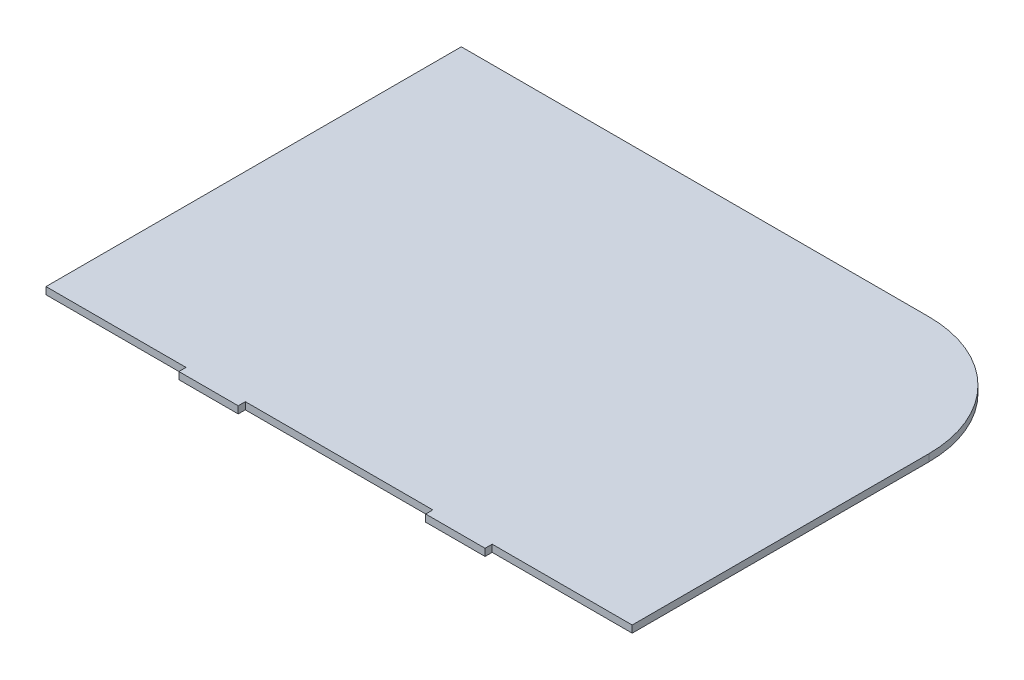
ISO-10303-21;
HEADER;
FILE_DESCRIPTION(('STEP AP214'),'2;1');
FILE_NAME('part.step','',(''),(''),'','','');
FILE_SCHEMA(('AUTOMOTIVE_DESIGN { 1 0 10303 214 1 1 1 1 }'));
ENDSEC;
DATA;
#1=APPLICATION_CONTEXT('core data for automotive mechanical design processes');
#2=APPLICATION_PROTOCOL_DEFINITION('international standard','automotive_design',2000,#1);
#3=PRODUCT_CONTEXT('',#1,'mechanical');
#4=PRODUCT('Part','Part','',(#3));
#5=PRODUCT_RELATED_PRODUCT_CATEGORY('part','',(#4));
#6=PRODUCT_DEFINITION_FORMATION('','',#4);
#7=PRODUCT_DEFINITION_CONTEXT('part definition',#1,'design');
#8=PRODUCT_DEFINITION('design','',#6,#7);
#9=PRODUCT_DEFINITION_SHAPE('','',#8);
#10=(LENGTH_UNIT() NAMED_UNIT(*) SI_UNIT(.MILLI.,.METRE.));
#11=(NAMED_UNIT(*) PLANE_ANGLE_UNIT() SI_UNIT($,.RADIAN.));
#12=(NAMED_UNIT(*) SI_UNIT($,.STERADIAN.) SOLID_ANGLE_UNIT());
#13=UNCERTAINTY_MEASURE_WITH_UNIT(LENGTH_MEASURE(1.E-05),#10,'distance_accuracy_value','');
#14=(GEOMETRIC_REPRESENTATION_CONTEXT(3) GLOBAL_UNCERTAINTY_ASSIGNED_CONTEXT((#13)) GLOBAL_UNIT_ASSIGNED_CONTEXT((#10,
#11,#12)) REPRESENTATION_CONTEXT('',''));
#15=CARTESIAN_POINT('',(0.,0.,0.));
#16=DIRECTION('',(0.,0.,1.));
#17=DIRECTION('',(1.,0.,0.));
#18=AXIS2_PLACEMENT_3D('',#15,#16,#17);
#19=CARTESIAN_POINT('',(222.064062014742,6.,230.864850181117));
#20=DIRECTION('',(-1.,0.,0.));
#21=DIRECTION('',(0.,0.,1.));
#22=AXIS2_PLACEMENT_3D('',#19,#20,#21);
#23=PLANE('',#22);
#24=DIRECTION('',(0.,0.,-1.));
#25=VECTOR('',#24,1.);
#26=CARTESIAN_POINT('',(222.064062014742,0.,230.864850181117));
#27=LINE('',#26,#25);
#28=CARTESIAN_POINT('',(222.064062014742,0.,230.864850181117));
#29=VERTEX_POINT('',#28);
#30=CARTESIAN_POINT('',(222.064062014742,0.,-19.1351498188829));
#31=VERTEX_POINT('',#30);
#32=EDGE_CURVE('E159',#29,#31,#27,.T.);
#33=ORIENTED_EDGE('',*,*,#32,.T.);
#34=DIRECTION('',(0.,-1.,0.));
#35=VECTOR('',#34,1.);
#36=CARTESIAN_POINT('',(222.064062014742,6.,-19.1351498188829));
#37=LINE('',#36,#35);
#38=CARTESIAN_POINT('',(222.064062014742,6.,-19.1351498188829));
#39=VERTEX_POINT('',#38);
#40=EDGE_CURVE('E11',#39,#31,#37,.T.);
#41=ORIENTED_EDGE('',*,*,#40,.F.);
#42=DIRECTION('',(0.,0.,-1.));
#43=VECTOR('',#42,1.);
#44=CARTESIAN_POINT('',(222.064062014742,6.,230.864850181117));
#45=LINE('',#44,#43);
#46=CARTESIAN_POINT('',(222.064062014742,6.,230.864850181117));
#47=VERTEX_POINT('',#46);
#48=EDGE_CURVE('E183',#47,#39,#45,.T.);
#49=ORIENTED_EDGE('',*,*,#48,.F.);
#50=DIRECTION('',(0.,-1.,0.));
#51=VECTOR('',#50,1.);
#52=CARTESIAN_POINT('',(222.064062014742,6.,230.864850181117));
#53=LINE('',#52,#51);
#54=EDGE_CURVE('E155',#47,#29,#53,.T.);
#55=ORIENTED_EDGE('',*,*,#54,.T.);
#56=EDGE_LOOP('',(#33,#41,#49,#55));
#57=FACE_BOUND('',#56,.T.);
#58=ADVANCED_FACE('F33',(#57),#23,.F.);
#59=CARTESIAN_POINT('',(122.064062014742,6.,-19.1351498188829));
#60=DIRECTION('',(0.,-1.,0.));
#61=DIRECTION('',(0.,0.,-1.));
#62=AXIS2_PLACEMENT_3D('',#59,#60,#61);
#63=CYLINDRICAL_SURFACE('',#62,100.);
#64=CARTESIAN_POINT('',(122.064062014742,0.,-19.1351498188829));
#65=DIRECTION('',(0.,1.,0.));
#66=DIRECTION('',(0.,0.,1.));
#67=AXIS2_PLACEMENT_3D('',#64,#65,#66);
#68=CIRCLE('',#67,100.);
#69=CARTESIAN_POINT('',(122.064062014742,0.,-119.135149818883));
#70=VERTEX_POINT('',#69);
#71=EDGE_CURVE('E162',#31,#70,#68,.T.);
#72=ORIENTED_EDGE('',*,*,#71,.T.);
#73=DIRECTION('',(0.,-1.,0.));
#74=VECTOR('',#73,1.);
#75=CARTESIAN_POINT('',(122.064062014742,6.,-119.135149818883));
#76=LINE('',#75,#74);
#77=CARTESIAN_POINT('',(122.064062014742,6.,-119.135149818883));
#78=VERTEX_POINT('',#77);
#79=EDGE_CURVE('E41',#78,#70,#76,.T.);
#80=ORIENTED_EDGE('',*,*,#79,.F.);
#81=CARTESIAN_POINT('',(122.064062014742,6.,-19.1351498188829));
#82=DIRECTION('',(0.,1.,0.));
#83=DIRECTION('',(0.,0.,1.));
#84=AXIS2_PLACEMENT_3D('',#81,#82,#83);
#85=CIRCLE('',#84,100.);
#86=EDGE_CURVE('E107',#39,#78,#85,.T.);
#87=ORIENTED_EDGE('',*,*,#86,.F.);
#88=ORIENTED_EDGE('',*,*,#40,.T.);
#89=EDGE_LOOP('',(#72,#80,#87,#88));
#90=FACE_BOUND('',#89,.T.);
#91=ADVANCED_FACE('F266',(#90),#63,.T.);
#92=CARTESIAN_POINT('',(-271.935937985258,6.,-119.135149818883));
#93=DIRECTION('',(0.,0.,1.));
#94=DIRECTION('',(1.,0.,0.));
#95=AXIS2_PLACEMENT_3D('',#92,#93,#94);
#96=PLANE('',#95);
#97=DIRECTION('',(-1.,0.,0.));
#98=VECTOR('',#97,1.);
#99=CARTESIAN_POINT('',(-271.935937985258,0.,-119.135149818883));
#100=LINE('',#99,#98);
#101=CARTESIAN_POINT('',(-271.935937985258,0.,-119.135149818883));
#102=VERTEX_POINT('',#101);
#103=EDGE_CURVE('E164',#70,#102,#100,.T.);
#104=ORIENTED_EDGE('',*,*,#103,.T.);
#105=DIRECTION('',(0.,-1.,0.));
#106=VECTOR('',#105,1.);
#107=CARTESIAN_POINT('',(-271.935937985258,6.,-119.135149818883));
#108=LINE('',#107,#106);
#109=CARTESIAN_POINT('',(-271.935937985258,6.,-119.135149818883));
#110=VERTEX_POINT('',#109);
#111=EDGE_CURVE('E205',#110,#102,#108,.T.);
#112=ORIENTED_EDGE('',*,*,#111,.F.);
#113=DIRECTION('',(-1.,0.,0.));
#114=VECTOR('',#113,1.);
#115=CARTESIAN_POINT('',(-271.935937985258,6.,-119.135149818883));
#116=LINE('',#115,#114);
#117=EDGE_CURVE('E213',#78,#110,#116,.T.);
#118=ORIENTED_EDGE('',*,*,#117,.F.);
#119=ORIENTED_EDGE('',*,*,#79,.T.);
#120=EDGE_LOOP('',(#104,#112,#118,#119));
#121=FACE_BOUND('',#120,.T.);
#122=ADVANCED_FACE('F211',(#121),#96,.F.);
#123=CARTESIAN_POINT('',(-271.935937985258,6.,-119.135149818883));
#124=DIRECTION('',(1.,0.,0.));
#125=DIRECTION('',(0.,0.,-1.));
#126=AXIS2_PLACEMENT_3D('',#123,#124,#125);
#127=PLANE('',#126);
#128=DIRECTION('',(0.,0.,1.));
#129=VECTOR('',#128,1.);
#130=CARTESIAN_POINT('',(-271.935937985258,0.,-119.135149818883));
#131=LINE('',#130,#129);
#132=CARTESIAN_POINT('',(-271.935937985258,0.,230.864850181117));
#133=VERTEX_POINT('',#132);
#134=EDGE_CURVE('E166',#102,#133,#131,.T.);
#135=ORIENTED_EDGE('',*,*,#134,.T.);
#136=DIRECTION('',(0.,-1.,0.));
#137=VECTOR('',#136,1.);
#138=CARTESIAN_POINT('',(-271.935937985258,6.,230.864850181117));
#139=LINE('',#138,#137);
#140=CARTESIAN_POINT('',(-271.935937985258,6.,230.864850181117));
#141=VERTEX_POINT('',#140);
#142=EDGE_CURVE('E202',#141,#133,#139,.T.);
#143=ORIENTED_EDGE('',*,*,#142,.F.);
#144=DIRECTION('',(0.,0.,1.));
#145=VECTOR('',#144,1.);
#146=CARTESIAN_POINT('',(-271.935937985258,6.,-119.135149818883));
#147=LINE('',#146,#145);
#148=EDGE_CURVE('E231',#110,#141,#147,.T.);
#149=ORIENTED_EDGE('',*,*,#148,.F.);
#150=ORIENTED_EDGE('',*,*,#111,.T.);
#151=EDGE_LOOP('',(#135,#143,#149,#150));
#152=FACE_BOUND('',#151,.T.);
#153=ADVANCED_FACE('F222',(#152),#127,.F.);
#154=CARTESIAN_POINT('',(-271.935937985258,6.,230.864850181117));
#155=DIRECTION('',(0.,0.,-1.));
#156=DIRECTION('',(-1.,0.,0.));
#157=AXIS2_PLACEMENT_3D('',#154,#155,#156);
#158=PLANE('',#157);
#159=DIRECTION('',(1.,0.,0.));
#160=VECTOR('',#159,1.);
#161=CARTESIAN_POINT('',(-271.935937985258,0.,230.864850181117));
#162=LINE('',#161,#160);
#163=CARTESIAN_POINT('',(-153.935937985258,0.,230.864850181117));
#164=VERTEX_POINT('',#163);
#165=EDGE_CURVE('E168',#133,#164,#162,.T.);
#166=ORIENTED_EDGE('',*,*,#165,.T.);
#167=DIRECTION('',(0.,-1.,0.));
#168=VECTOR('',#167,1.);
#169=CARTESIAN_POINT('',(-153.935937985258,6.,230.864850181117));
#170=LINE('',#169,#168);
#171=CARTESIAN_POINT('',(-153.935937985258,6.,230.864850181117));
#172=VERTEX_POINT('',#171);
#173=EDGE_CURVE('E199',#172,#164,#170,.T.);
#174=ORIENTED_EDGE('',*,*,#173,.F.);
#175=DIRECTION('',(1.,0.,0.));
#176=VECTOR('',#175,1.);
#177=CARTESIAN_POINT('',(-271.935937985258,6.,230.864850181117));
#178=LINE('',#177,#176);
#179=EDGE_CURVE('E228',#141,#172,#178,.T.);
#180=ORIENTED_EDGE('',*,*,#179,.F.);
#181=ORIENTED_EDGE('',*,*,#142,.T.);
#182=EDGE_LOOP('',(#166,#174,#180,#181));
#183=FACE_BOUND('',#182,.T.);
#184=ADVANCED_FACE('F226',(#183),#158,.F.);
#185=CARTESIAN_POINT('',(-153.935937985258,6.,230.864850181117));
#186=DIRECTION('',(1.,0.,0.));
#187=DIRECTION('',(0.,0.,-1.));
#188=AXIS2_PLACEMENT_3D('',#185,#186,#187);
#189=PLANE('',#188);
#190=DIRECTION('',(0.,0.,1.));
#191=VECTOR('',#190,1.);
#192=CARTESIAN_POINT('',(-153.935937985258,0.,230.864850181117));
#193=LINE('',#192,#191);
#194=CARTESIAN_POINT('',(-153.935937985258,0.,236.864850181117));
#195=VERTEX_POINT('',#194);
#196=EDGE_CURVE('E170',#164,#195,#193,.T.);
#197=ORIENTED_EDGE('',*,*,#196,.T.);
#198=DIRECTION('',(0.,-1.,0.));
#199=VECTOR('',#198,1.);
#200=CARTESIAN_POINT('',(-153.935937985258,6.,236.864850181117));
#201=LINE('',#200,#199);
#202=CARTESIAN_POINT('',(-153.935937985258,6.,236.864850181117));
#203=VERTEX_POINT('',#202);
#204=EDGE_CURVE('E196',#203,#195,#201,.T.);
#205=ORIENTED_EDGE('',*,*,#204,.F.);
#206=DIRECTION('',(0.,0.,1.));
#207=VECTOR('',#206,1.);
#208=CARTESIAN_POINT('',(-153.935937985258,6.,230.864850181117));
#209=LINE('',#208,#207);
#210=EDGE_CURVE('E230',#172,#203,#209,.T.);
#211=ORIENTED_EDGE('',*,*,#210,.F.);
#212=ORIENTED_EDGE('',*,*,#173,.T.);
#213=EDGE_LOOP('',(#197,#205,#211,#212));
#214=FACE_BOUND('',#213,.T.);
#215=ADVANCED_FACE('F279',(#214),#189,.F.);
#216=CARTESIAN_POINT('',(-153.935937985258,6.,236.864850181117));
#217=DIRECTION('',(0.,0.,-1.));
#218=DIRECTION('',(-1.,0.,0.));
#219=AXIS2_PLACEMENT_3D('',#216,#217,#218);
#220=PLANE('',#219);
#221=DIRECTION('',(1.,0.,0.));
#222=VECTOR('',#221,1.);
#223=CARTESIAN_POINT('',(-153.935937985258,0.,236.864850181117));
#224=LINE('',#223,#222);
#225=CARTESIAN_POINT('',(-103.935937985258,0.,236.864850181117));
#226=VERTEX_POINT('',#225);
#227=EDGE_CURVE('E172',#195,#226,#224,.T.);
#228=ORIENTED_EDGE('',*,*,#227,.T.);
#229=DIRECTION('',(0.,-1.,0.));
#230=VECTOR('',#229,1.);
#231=CARTESIAN_POINT('',(-103.935937985258,6.,236.864850181117));
#232=LINE('',#231,#230);
#233=CARTESIAN_POINT('',(-103.935937985258,6.,236.864850181117));
#234=VERTEX_POINT('',#233);
#235=EDGE_CURVE('E193',#234,#226,#232,.T.);
#236=ORIENTED_EDGE('',*,*,#235,.F.);
#237=DIRECTION('',(1.,0.,0.));
#238=VECTOR('',#237,1.);
#239=CARTESIAN_POINT('',(-153.935937985258,6.,236.864850181117));
#240=LINE('',#239,#238);
#241=EDGE_CURVE('E233',#203,#234,#240,.T.);
#242=ORIENTED_EDGE('',*,*,#241,.F.);
#243=ORIENTED_EDGE('',*,*,#204,.T.);
#244=EDGE_LOOP('',(#228,#236,#242,#243));
#245=FACE_BOUND('',#244,.T.);
#246=ADVANCED_FACE('F282',(#245),#220,.F.);
#247=CARTESIAN_POINT('',(-103.935937985258,6.,230.864850181117));
#248=DIRECTION('',(-1.,0.,0.));
#249=DIRECTION('',(0.,0.,1.));
#250=AXIS2_PLACEMENT_3D('',#247,#248,#249);
#251=PLANE('',#250);
#252=DIRECTION('',(0.,0.,-1.));
#253=VECTOR('',#252,1.);
#254=CARTESIAN_POINT('',(-103.935937985258,0.,230.864850181117));
#255=LINE('',#254,#253);
#256=CARTESIAN_POINT('',(-103.935937985258,0.,230.864850181117));
#257=VERTEX_POINT('',#256);
#258=EDGE_CURVE('E174',#226,#257,#255,.T.);
#259=ORIENTED_EDGE('',*,*,#258,.T.);
#260=DIRECTION('',(0.,-1.,0.));
#261=VECTOR('',#260,1.);
#262=CARTESIAN_POINT('',(-103.935937985258,6.,230.864850181117));
#263=LINE('',#262,#261);
#264=CARTESIAN_POINT('',(-103.935937985258,6.,230.864850181117));
#265=VERTEX_POINT('',#264);
#266=EDGE_CURVE('E190',#265,#257,#263,.T.);
#267=ORIENTED_EDGE('',*,*,#266,.F.);
#268=DIRECTION('',(0.,0.,-1.));
#269=VECTOR('',#268,1.);
#270=CARTESIAN_POINT('',(-103.935937985258,6.,230.864850181117));
#271=LINE('',#270,#269);
#272=EDGE_CURVE('E239',#234,#265,#271,.T.);
#273=ORIENTED_EDGE('',*,*,#272,.F.);
#274=ORIENTED_EDGE('',*,*,#235,.T.);
#275=EDGE_LOOP('',(#259,#267,#273,#274));
#276=FACE_BOUND('',#275,.T.);
#277=ADVANCED_FACE('F286',(#276),#251,.F.);
#278=CARTESIAN_POINT('',(-103.935937985258,6.,230.864850181117));
#279=DIRECTION('',(0.,0.,-1.));
#280=DIRECTION('',(-1.,0.,0.));
#281=AXIS2_PLACEMENT_3D('',#278,#279,#280);
#282=PLANE('',#281);
#283=DIRECTION('',(1.,0.,0.));
#284=VECTOR('',#283,1.);
#285=CARTESIAN_POINT('',(-103.935937985258,0.,230.864850181117));
#286=LINE('',#285,#284);
#287=CARTESIAN_POINT('',(54.0640620147421,0.,230.864850181117));
#288=VERTEX_POINT('',#287);
#289=EDGE_CURVE('E176',#257,#288,#286,.T.);
#290=ORIENTED_EDGE('',*,*,#289,.T.);
#291=DIRECTION('',(0.,-1.,0.));
#292=VECTOR('',#291,1.);
#293=CARTESIAN_POINT('',(54.0640620147421,6.,230.864850181117));
#294=LINE('',#293,#292);
#295=CARTESIAN_POINT('',(54.0640620147421,6.,230.864850181117));
#296=VERTEX_POINT('',#295);
#297=EDGE_CURVE('E187',#296,#288,#294,.T.);
#298=ORIENTED_EDGE('',*,*,#297,.F.);
#299=DIRECTION('',(1.,0.,0.));
#300=VECTOR('',#299,1.);
#301=CARTESIAN_POINT('',(-103.935937985258,6.,230.864850181117));
#302=LINE('',#301,#300);
#303=EDGE_CURVE('E241',#265,#296,#302,.T.);
#304=ORIENTED_EDGE('',*,*,#303,.F.);
#305=ORIENTED_EDGE('',*,*,#266,.T.);
#306=EDGE_LOOP('',(#290,#298,#304,#305));
#307=FACE_BOUND('',#306,.T.);
#308=ADVANCED_FACE('F247',(#307),#282,.F.);
#309=CARTESIAN_POINT('',(54.0640620147421,6.,230.864850181117));
#310=DIRECTION('',(1.,0.,0.));
#311=DIRECTION('',(0.,0.,-1.));
#312=AXIS2_PLACEMENT_3D('',#309,#310,#311);
#313=PLANE('',#312);
#314=DIRECTION('',(0.,0.,1.));
#315=VECTOR('',#314,1.);
#316=CARTESIAN_POINT('',(54.0640620147421,0.,230.864850181117));
#317=LINE('',#316,#315);
#318=CARTESIAN_POINT('',(54.0640620147421,0.,236.864850181117));
#319=VERTEX_POINT('',#318);
#320=EDGE_CURVE('E178',#288,#319,#317,.T.);
#321=ORIENTED_EDGE('',*,*,#320,.T.);
#322=DIRECTION('',(0.,-1.,0.));
#323=VECTOR('',#322,1.);
#324=CARTESIAN_POINT('',(54.0640620147421,6.,236.864850181117));
#325=LINE('',#324,#323);
#326=CARTESIAN_POINT('',(54.0640620147421,6.,236.864850181117));
#327=VERTEX_POINT('',#326);
#328=EDGE_CURVE('E150',#327,#319,#325,.T.);
#329=ORIENTED_EDGE('',*,*,#328,.F.);
#330=DIRECTION('',(0.,0.,1.));
#331=VECTOR('',#330,1.);
#332=CARTESIAN_POINT('',(54.0640620147421,6.,230.864850181117));
#333=LINE('',#332,#331);
#334=EDGE_CURVE('E141',#296,#327,#333,.T.);
#335=ORIENTED_EDGE('',*,*,#334,.F.);
#336=ORIENTED_EDGE('',*,*,#297,.T.);
#337=EDGE_LOOP('',(#321,#329,#335,#336));
#338=FACE_BOUND('',#337,.T.);
#339=ADVANCED_FACE('F251',(#338),#313,.F.);
#340=CARTESIAN_POINT('',(54.0640620147421,6.,236.864850181117));
#341=DIRECTION('',(0.,0.,-1.));
#342=DIRECTION('',(-1.,0.,0.));
#343=AXIS2_PLACEMENT_3D('',#340,#341,#342);
#344=PLANE('',#343);
#345=DIRECTION('',(1.,0.,0.));
#346=VECTOR('',#345,1.);
#347=CARTESIAN_POINT('',(54.0640620147421,0.,236.864850181117));
#348=LINE('',#347,#346);
#349=CARTESIAN_POINT('',(104.064062014742,0.,236.864850181117));
#350=VERTEX_POINT('',#349);
#351=EDGE_CURVE('E149',#319,#350,#348,.T.);
#352=ORIENTED_EDGE('',*,*,#351,.T.);
#353=DIRECTION('',(0.,-1.,0.));
#354=VECTOR('',#353,1.);
#355=CARTESIAN_POINT('',(104.064062014742,6.,236.864850181117));
#356=LINE('',#355,#354);
#357=CARTESIAN_POINT('',(104.064062014742,6.,236.864850181117));
#358=VERTEX_POINT('',#357);
#359=EDGE_CURVE('E146',#358,#350,#356,.T.);
#360=ORIENTED_EDGE('',*,*,#359,.F.);
#361=DIRECTION('',(1.,0.,0.));
#362=VECTOR('',#361,1.);
#363=CARTESIAN_POINT('',(54.0640620147421,6.,236.864850181117));
#364=LINE('',#363,#362);
#365=EDGE_CURVE('E135',#327,#358,#364,.T.);
#366=ORIENTED_EDGE('',*,*,#365,.F.);
#367=ORIENTED_EDGE('',*,*,#328,.T.);
#368=EDGE_LOOP('',(#352,#360,#366,#367));
#369=FACE_BOUND('',#368,.T.);
#370=ADVANCED_FACE('F147',(#369),#344,.F.);
#371=CARTESIAN_POINT('',(104.064062014742,6.,236.864850181117));
#372=DIRECTION('',(-1.,0.,0.));
#373=DIRECTION('',(0.,0.,1.));
#374=AXIS2_PLACEMENT_3D('',#371,#372,#373);
#375=PLANE('',#374);
#376=DIRECTION('',(0.,0.,-1.));
#377=VECTOR('',#376,1.);
#378=CARTESIAN_POINT('',(104.064062014742,0.,236.864850181117));
#379=LINE('',#378,#377);
#380=CARTESIAN_POINT('',(104.064062014742,0.,230.864850181117));
#381=VERTEX_POINT('',#380);
#382=EDGE_CURVE('E93',#350,#381,#379,.T.);
#383=ORIENTED_EDGE('',*,*,#382,.T.);
#384=DIRECTION('',(0.,-1.,0.));
#385=VECTOR('',#384,1.);
#386=CARTESIAN_POINT('',(104.064062014742,6.,230.864850181117));
#387=LINE('',#386,#385);
#388=CARTESIAN_POINT('',(104.064062014742,6.,230.864850181117));
#389=VERTEX_POINT('',#388);
#390=EDGE_CURVE('E151',#389,#381,#387,.T.);
#391=ORIENTED_EDGE('',*,*,#390,.F.);
#392=DIRECTION('',(0.,0.,-1.));
#393=VECTOR('',#392,1.);
#394=CARTESIAN_POINT('',(104.064062014742,6.,236.864850181117));
#395=LINE('',#394,#393);
#396=EDGE_CURVE('E139',#358,#389,#395,.T.);
#397=ORIENTED_EDGE('',*,*,#396,.F.);
#398=ORIENTED_EDGE('',*,*,#359,.T.);
#399=EDGE_LOOP('',(#383,#391,#397,#398));
#400=FACE_BOUND('',#399,.T.);
#401=ADVANCED_FACE('F153',(#400),#375,.F.);
#402=CARTESIAN_POINT('',(104.064062014742,6.,230.864850181117));
#403=DIRECTION('',(0.,0.,-1.));
#404=DIRECTION('',(-1.,0.,0.));
#405=AXIS2_PLACEMENT_3D('',#402,#403,#404);
#406=PLANE('',#405);
#407=DIRECTION('',(1.,0.,0.));
#408=VECTOR('',#407,1.);
#409=CARTESIAN_POINT('',(104.064062014742,0.,230.864850181117));
#410=LINE('',#409,#408);
#411=EDGE_CURVE('E99',#381,#29,#410,.T.);
#412=ORIENTED_EDGE('',*,*,#411,.T.);
#413=ORIENTED_EDGE('',*,*,#54,.F.);
#414=DIRECTION('',(1.,0.,0.));
#415=VECTOR('',#414,1.);
#416=CARTESIAN_POINT('',(104.064062014742,6.,230.864850181117));
#417=LINE('',#416,#415);
#418=EDGE_CURVE('E49',#389,#47,#417,.T.);
#419=ORIENTED_EDGE('',*,*,#418,.F.);
#420=ORIENTED_EDGE('',*,*,#390,.T.);
#421=EDGE_LOOP('',(#412,#413,#419,#420));
#422=FACE_BOUND('',#421,.T.);
#423=ADVANCED_FACE('F255',(#422),#406,.F.);
#424=CARTESIAN_POINT('',(122.064062014742,6.,-19.1351498188829));
#425=DIRECTION('',(0.,1.,0.));
#426=DIRECTION('',(0.,0.,1.));
#427=AXIS2_PLACEMENT_3D('',#424,#425,#426);
#428=PLANE('',#427);
#429=ORIENTED_EDGE('',*,*,#48,.T.);
#430=ORIENTED_EDGE('',*,*,#86,.T.);
#431=ORIENTED_EDGE('',*,*,#117,.T.);
#432=ORIENTED_EDGE('',*,*,#148,.T.);
#433=ORIENTED_EDGE('',*,*,#179,.T.);
#434=ORIENTED_EDGE('',*,*,#210,.T.);
#435=ORIENTED_EDGE('',*,*,#241,.T.);
#436=ORIENTED_EDGE('',*,*,#272,.T.);
#437=ORIENTED_EDGE('',*,*,#303,.T.);
#438=ORIENTED_EDGE('',*,*,#334,.T.);
#439=ORIENTED_EDGE('',*,*,#365,.T.);
#440=ORIENTED_EDGE('',*,*,#396,.T.);
#441=ORIENTED_EDGE('',*,*,#418,.T.);
#442=EDGE_LOOP('',(#429,#430,#431,#432,#433,#434,#435,#436,#437,#438,#439,#440,#441));
#443=FACE_BOUND('',#442,.T.);
#444=ADVANCED_FACE('F137',(#443),#428,.T.);
#445=CARTESIAN_POINT('',(122.064062014742,0.,-19.1351498188829));
#446=DIRECTION('',(0.,1.,0.));
#447=DIRECTION('',(0.,0.,1.));
#448=AXIS2_PLACEMENT_3D('',#445,#446,#447);
#449=PLANE('',#448);
#450=ORIENTED_EDGE('',*,*,#32,.F.);
#451=ORIENTED_EDGE('',*,*,#411,.F.);
#452=ORIENTED_EDGE('',*,*,#382,.F.);
#453=ORIENTED_EDGE('',*,*,#351,.F.);
#454=ORIENTED_EDGE('',*,*,#320,.F.);
#455=ORIENTED_EDGE('',*,*,#289,.F.);
#456=ORIENTED_EDGE('',*,*,#258,.F.);
#457=ORIENTED_EDGE('',*,*,#227,.F.);
#458=ORIENTED_EDGE('',*,*,#196,.F.);
#459=ORIENTED_EDGE('',*,*,#165,.F.);
#460=ORIENTED_EDGE('',*,*,#134,.F.);
#461=ORIENTED_EDGE('',*,*,#103,.F.);
#462=ORIENTED_EDGE('',*,*,#71,.F.);
#463=EDGE_LOOP('',(#450,#451,#452,#453,#454,#455,#456,#457,#458,#459,#460,#461,#462));
#464=FACE_BOUND('',#463,.T.);
#465=ADVANCED_FACE('F217',(#464),#449,.F.);
#466=CLOSED_SHELL('',(#58,#91,#122,#153,#184,#215,#246,#277,#308,#339,#370,#401,#423,#444,#465));
#467=MANIFOLD_SOLID_BREP('B2',#466);
#468=ADVANCED_BREP_SHAPE_REPRESENTATION('',(#18,#467),#14);
#469=SHAPE_DEFINITION_REPRESENTATION(#9,#468);
ENDSEC;
END-ISO-10303-21;
